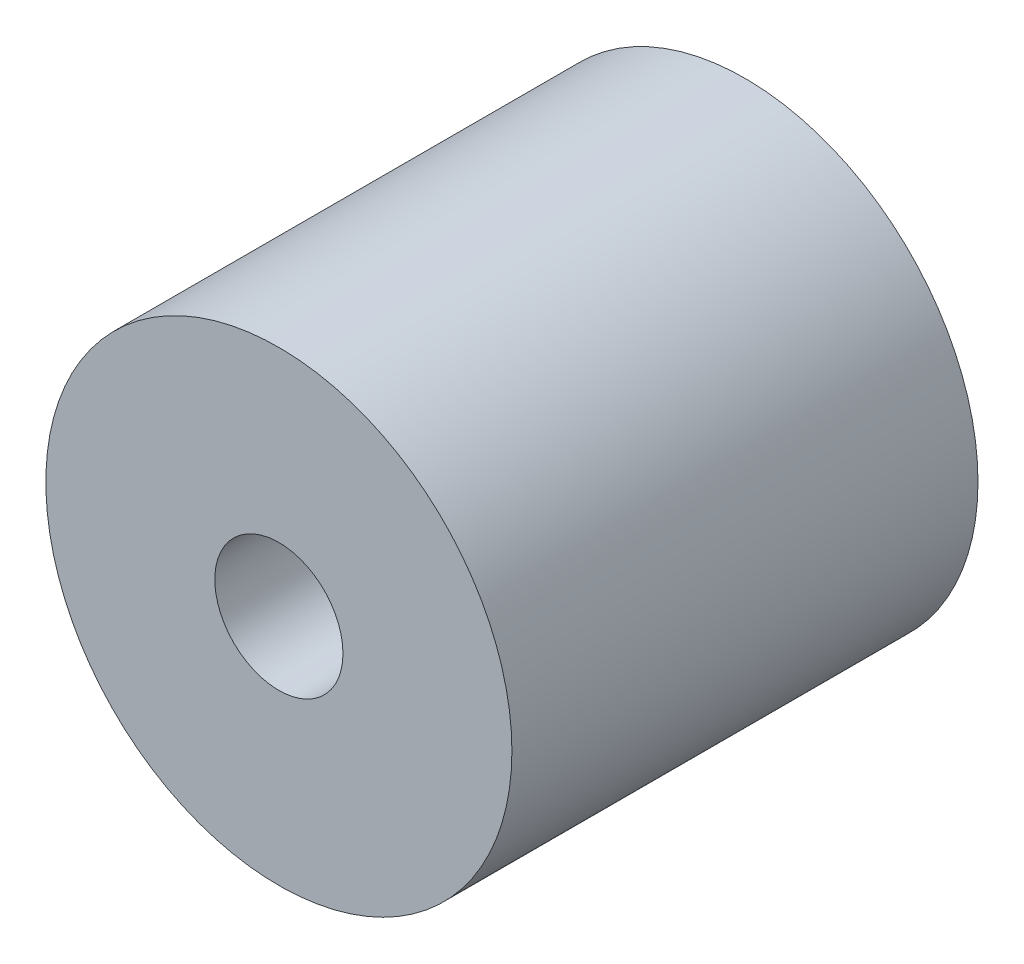
ISO-10303-21;
HEADER;
FILE_DESCRIPTION(('STEP AP214'),'2;1');
FILE_NAME('part.step','',(''),(''),'','','');
FILE_SCHEMA(('AUTOMOTIVE_DESIGN { 1 0 10303 214 1 1 1 1 }'));
ENDSEC;
DATA;
#1=APPLICATION_CONTEXT('core data for automotive mechanical design processes');
#2=APPLICATION_PROTOCOL_DEFINITION('international standard','automotive_design',2000,#1);
#3=PRODUCT_CONTEXT('',#1,'mechanical');
#4=PRODUCT('Part','Part','',(#3));
#5=PRODUCT_RELATED_PRODUCT_CATEGORY('part','',(#4));
#6=PRODUCT_DEFINITION_FORMATION('','',#4);
#7=PRODUCT_DEFINITION_CONTEXT('part definition',#1,'design');
#8=PRODUCT_DEFINITION('design','',#6,#7);
#9=PRODUCT_DEFINITION_SHAPE('','',#8);
#10=(LENGTH_UNIT() NAMED_UNIT(*) SI_UNIT(.MILLI.,.METRE.));
#11=(NAMED_UNIT(*) PLANE_ANGLE_UNIT() SI_UNIT($,.RADIAN.));
#12=(NAMED_UNIT(*) SI_UNIT($,.STERADIAN.) SOLID_ANGLE_UNIT());
#13=UNCERTAINTY_MEASURE_WITH_UNIT(LENGTH_MEASURE(1.E-05),#10,'distance_accuracy_value','');
#14=(GEOMETRIC_REPRESENTATION_CONTEXT(3) GLOBAL_UNCERTAINTY_ASSIGNED_CONTEXT((#13)) GLOBAL_UNIT_ASSIGNED_CONTEXT((#10,
#11,#12)) REPRESENTATION_CONTEXT('',''));
#15=CARTESIAN_POINT('',(0.,0.,0.));
#16=DIRECTION('',(0.,0.,1.));
#17=DIRECTION('',(1.,0.,0.));
#18=AXIS2_PLACEMENT_3D('',#15,#16,#17);
#19=CARTESIAN_POINT('',(0.,0.,8.));
#20=DIRECTION('',(0.,0.,1.));
#21=DIRECTION('',(1.,0.,0.));
#22=AXIS2_PLACEMENT_3D('',#19,#20,#21);
#23=PLANE('',#22);
#24=CARTESIAN_POINT('',(0.,0.,8.));
#25=DIRECTION('',(0.,0.,1.));
#26=DIRECTION('',(1.,0.,0.));
#27=AXIS2_PLACEMENT_3D('',#24,#25,#26);
#28=CIRCLE('',#27,4.);
#29=CARTESIAN_POINT('',(4.,0.,8.));
#30=VERTEX_POINT('',#29);
#31=EDGE_CURVE('E10',#30,#30,#28,.T.);
#32=ORIENTED_EDGE('',*,*,#31,.T.);
#33=EDGE_LOOP('',(#32));
#34=FACE_BOUND('',#33,.T.);
#35=CARTESIAN_POINT('',(0.,0.,8.));
#36=DIRECTION('',(0.,0.,1.));
#37=DIRECTION('',(1.,0.,0.));
#38=AXIS2_PLACEMENT_3D('',#35,#36,#37);
#39=CIRCLE('',#38,1.1);
#40=CARTESIAN_POINT('',(1.1,0.,8.));
#41=VERTEX_POINT('',#40);
#42=EDGE_CURVE('E42',#41,#41,#39,.T.);
#43=ORIENTED_EDGE('',*,*,#42,.F.);
#44=EDGE_LOOP('',(#43));
#45=FACE_BOUND('',#44,.T.);
#46=ADVANCED_FACE('F31',(#34,#45),#23,.T.);
#47=CARTESIAN_POINT('',(0.,0.,0.));
#48=DIRECTION('',(0.,0.,1.));
#49=DIRECTION('',(1.,0.,0.));
#50=AXIS2_PLACEMENT_3D('',#47,#48,#49);
#51=PLANE('',#50);
#52=CARTESIAN_POINT('',(0.,0.,0.));
#53=DIRECTION('',(0.,0.,1.));
#54=DIRECTION('',(1.,0.,0.));
#55=AXIS2_PLACEMENT_3D('',#52,#53,#54);
#56=CIRCLE('',#55,4.);
#57=CARTESIAN_POINT('',(4.,0.,0.));
#58=VERTEX_POINT('',#57);
#59=EDGE_CURVE('E35',#58,#58,#56,.T.);
#60=ORIENTED_EDGE('',*,*,#59,.F.);
#61=EDGE_LOOP('',(#60));
#62=FACE_BOUND('',#61,.T.);
#63=CARTESIAN_POINT('',(0.,0.,0.));
#64=DIRECTION('',(0.,0.,1.));
#65=DIRECTION('',(1.,0.,0.));
#66=AXIS2_PLACEMENT_3D('',#63,#64,#65);
#67=CIRCLE('',#66,1.1);
#68=CARTESIAN_POINT('',(1.1,0.,0.));
#69=VERTEX_POINT('',#68);
#70=EDGE_CURVE('E44',#69,#69,#67,.T.);
#71=ORIENTED_EDGE('',*,*,#70,.T.);
#72=EDGE_LOOP('',(#71));
#73=FACE_BOUND('',#72,.T.);
#74=ADVANCED_FACE('F54',(#62,#73),#51,.F.);
#75=CARTESIAN_POINT('',(0.,0.,8.));
#76=DIRECTION('',(0.,0.,-1.));
#77=DIRECTION('',(-1.,0.,0.));
#78=AXIS2_PLACEMENT_3D('',#75,#76,#77);
#79=CYLINDRICAL_SURFACE('',#78,4.);
#80=ORIENTED_EDGE('',*,*,#31,.F.);
#81=EDGE_LOOP('',(#80));
#82=FACE_BOUND('',#81,.T.);
#83=ORIENTED_EDGE('',*,*,#59,.T.);
#84=EDGE_LOOP('',(#83));
#85=FACE_BOUND('',#84,.T.);
#86=ADVANCED_FACE('F33',(#82,#85),#79,.T.);
#87=CARTESIAN_POINT('',(0.,0.,8.));
#88=DIRECTION('',(0.,0.,-1.));
#89=DIRECTION('',(-1.,0.,0.));
#90=AXIS2_PLACEMENT_3D('',#87,#88,#89);
#91=CYLINDRICAL_SURFACE('',#90,1.1);
#92=ORIENTED_EDGE('',*,*,#42,.T.);
#93=EDGE_LOOP('',(#92));
#94=FACE_BOUND('',#93,.T.);
#95=ORIENTED_EDGE('',*,*,#70,.F.);
#96=EDGE_LOOP('',(#95));
#97=FACE_BOUND('',#96,.T.);
#98=ADVANCED_FACE('F50',(#94,#97),#91,.F.);
#99=CLOSED_SHELL('',(#46,#74,#86,#98));
#100=MANIFOLD_SOLID_BREP('B2',#99);
#101=ADVANCED_BREP_SHAPE_REPRESENTATION('',(#18,#100),#14);
#102=SHAPE_DEFINITION_REPRESENTATION(#9,#101);
ENDSEC;
END-ISO-10303-21;
